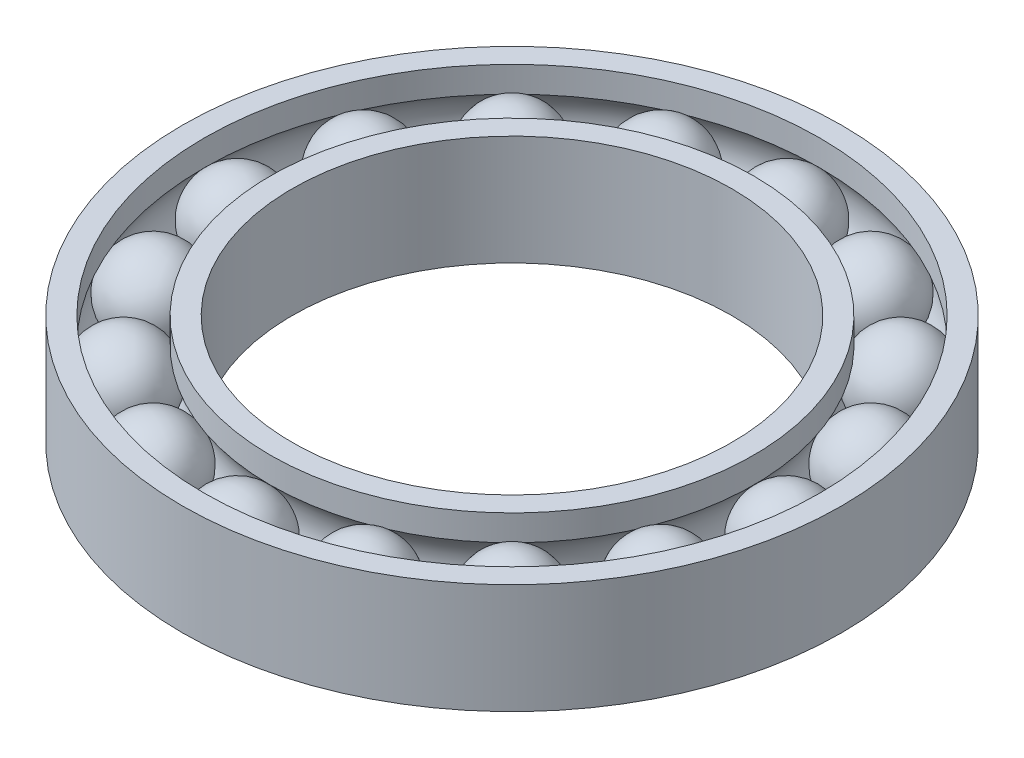
ISO-10303-21;
HEADER;
FILE_DESCRIPTION(('STEP AP214'),'2;1');
FILE_NAME('part.step','',(''),(''),'','','');
FILE_SCHEMA(('AUTOMOTIVE_DESIGN { 1 0 10303 214 1 1 1 1 }'));
ENDSEC;
DATA;
#1=APPLICATION_CONTEXT('core data for automotive mechanical design processes');
#2=APPLICATION_PROTOCOL_DEFINITION('international standard','automotive_design',2000,#1);
#3=PRODUCT_CONTEXT('',#1,'mechanical');
#4=PRODUCT('Part','Part','',(#3));
#5=PRODUCT_RELATED_PRODUCT_CATEGORY('part','',(#4));
#6=PRODUCT_DEFINITION_FORMATION('','',#4);
#7=PRODUCT_DEFINITION_CONTEXT('part definition',#1,'design');
#8=PRODUCT_DEFINITION('design','',#6,#7);
#9=PRODUCT_DEFINITION_SHAPE('','',#8);
#10=(LENGTH_UNIT() NAMED_UNIT(*) SI_UNIT(.MILLI.,.METRE.));
#11=(NAMED_UNIT(*) PLANE_ANGLE_UNIT() SI_UNIT($,.RADIAN.));
#12=(NAMED_UNIT(*) SI_UNIT($,.STERADIAN.) SOLID_ANGLE_UNIT());
#13=UNCERTAINTY_MEASURE_WITH_UNIT(LENGTH_MEASURE(1.E-05),#10,'distance_accuracy_value','');
#14=(GEOMETRIC_REPRESENTATION_CONTEXT(3) GLOBAL_UNCERTAINTY_ASSIGNED_CONTEXT((#13)) GLOBAL_UNIT_ASSIGNED_CONTEXT((#10,
#11,#12)) REPRESENTATION_CONTEXT('',''));
#15=CARTESIAN_POINT('',(0.,0.,0.));
#16=DIRECTION('',(0.,0.,1.));
#17=DIRECTION('',(1.,0.,0.));
#18=AXIS2_PLACEMENT_3D('',#15,#16,#17);
#19=CARTESIAN_POINT('',(23.9177145228173,0.,-57.7424707819557));
#20=DIRECTION('',(-0.382683432365077,0.,0.923879532511292));
#21=DIRECTION('',(0.,-1.,0.));
#22=AXIS2_PLACEMENT_3D('',#19,#20,#21);
#23=SPHERICAL_SURFACE('',#22,9.99999999999999);
#24=CARTESIAN_POINT('',(20.0908801991666,0.,-48.5036754568428));
#25=VERTEX_POINT('',#24);
#26=VERTEX_LOOP('',#25);
#27=FACE_BOUND('',#26,.T.);
#28=ADVANCED_FACE('F44',(#27),#23,.T.);
#29=CLOSED_SHELL('',(#28));
#30=MANIFOLD_SOLID_BREP('B2',#29);
#31=CARTESIAN_POINT('',(44.1941738241587,0.,-44.1941738241598));
#32=DIRECTION('',(-0.707106781186539,0.,0.707106781186556));
#33=DIRECTION('',(0.,-1.,0.));
#34=AXIS2_PLACEMENT_3D('',#31,#32,#33);
#35=SPHERICAL_SURFACE('',#34,9.99999999999999);
#36=CARTESIAN_POINT('',(37.1231060122933,0.,-37.1231060122942));
#37=VERTEX_POINT('',#36);
#38=VERTEX_LOOP('',#37);
#39=FACE_BOUND('',#38,.T.);
#40=ADVANCED_FACE('F63',(#39),#35,.T.);
#41=CLOSED_SHELL('',(#40));
#42=MANIFOLD_SOLID_BREP('B6',#41);
#43=CARTESIAN_POINT('',(57.7424707819552,0.,-23.9177145228187));
#44=DIRECTION('',(-0.923879532511283,0.,0.3826834323651));
#45=DIRECTION('',(0.,-1.,0.));
#46=AXIS2_PLACEMENT_3D('',#43,#44,#45);
#47=SPHERICAL_SURFACE('',#46,9.99999999999999);
#48=CARTESIAN_POINT('',(48.5036754568423,0.,-20.0908801991677));
#49=VERTEX_POINT('',#48);
#50=VERTEX_LOOP('',#49);
#51=FACE_BOUND('',#50,.T.);
#52=ADVANCED_FACE('F82',(#51),#47,.T.);
#53=CLOSED_SHELL('',(#52));
#54=MANIFOLD_SOLID_BREP('B40',#53);
#55=CARTESIAN_POINT('',(62.5,0.,-6.54652751033088E-13));
#56=DIRECTION('',(-1.,0.,0.));
#57=DIRECTION('',(0.,-1.,0.));
#58=AXIS2_PLACEMENT_3D('',#55,#56,#57);
#59=SPHERICAL_SURFACE('',#58,9.99999999999999);
#60=CARTESIAN_POINT('',(52.5,0.,-5.49908310867794E-13));
#61=VERTEX_POINT('',#60);
#62=VERTEX_LOOP('',#61);
#63=FACE_BOUND('',#62,.T.);
#64=ADVANCED_FACE('F101',(#63),#59,.T.);
#65=CLOSED_SHELL('',(#64));
#66=MANIFOLD_SOLID_BREP('B59',#65);
#67=CARTESIAN_POINT('',(57.7424707819557,0.,23.9177145228175));
#68=DIRECTION('',(-0.923879532511291,0.,-0.382683432365081));
#69=DIRECTION('',(0.,-1.,0.));
#70=AXIS2_PLACEMENT_3D('',#67,#68,#69);
#71=SPHERICAL_SURFACE('',#70,9.99999999999999);
#72=CARTESIAN_POINT('',(48.5036754568428,0.,20.0908801991667));
#73=VERTEX_POINT('',#72);
#74=VERTEX_LOOP('',#73);
#75=FACE_BOUND('',#74,.T.);
#76=ADVANCED_FACE('F120',(#75),#71,.T.);
#77=CLOSED_SHELL('',(#76));
#78=MANIFOLD_SOLID_BREP('B78',#77);
#79=CARTESIAN_POINT('',(44.1941738241596,0.,44.1941738241588));
#80=DIRECTION('',(-0.707106781186554,0.,-0.707106781186541));
#81=DIRECTION('',(0.,-1.,0.));
#82=AXIS2_PLACEMENT_3D('',#79,#80,#81);
#83=SPHERICAL_SURFACE('',#82,9.99999999999999);
#84=CARTESIAN_POINT('',(37.1231060122941,0.,37.1231060122934));
#85=VERTEX_POINT('',#84);
#86=VERTEX_LOOP('',#85);
#87=FACE_BOUND('',#86,.T.);
#88=ADVANCED_FACE('F139',(#87),#83,.T.);
#89=CLOSED_SHELL('',(#88));
#90=MANIFOLD_SOLID_BREP('B97',#89);
#91=CARTESIAN_POINT('',(23.9177145228186,0.,57.7424707819552));
#92=DIRECTION('',(-0.382683432365097,0.,-0.923879532511284));
#93=DIRECTION('',(0.,-1.,0.));
#94=AXIS2_PLACEMENT_3D('',#91,#92,#93);
#95=SPHERICAL_SURFACE('',#94,9.99999999999999);
#96=CARTESIAN_POINT('',(20.0908801991676,0.,48.5036754568424));
#97=VERTEX_POINT('',#96);
#98=VERTEX_LOOP('',#97);
#99=FACE_BOUND('',#98,.T.);
#100=ADVANCED_FACE('F158',(#99),#95,.T.);
#101=CLOSED_SHELL('',(#100));
#102=MANIFOLD_SOLID_BREP('B116',#101);
#103=CARTESIAN_POINT('',(0.,0.,62.5));
#104=DIRECTION('',(0.,0.,-1.));
#105=DIRECTION('',(0.,-1.,0.));
#106=AXIS2_PLACEMENT_3D('',#103,#104,#105);
#107=SPHERICAL_SURFACE('',#106,9.99999999999999);
#108=CARTESIAN_POINT('',(0.,0.,52.5));
#109=VERTEX_POINT('',#108);
#110=VERTEX_LOOP('',#109);
#111=FACE_BOUND('',#110,.T.);
#112=ADVANCED_FACE('F177',(#111),#107,.T.);
#113=CLOSED_SHELL('',(#112));
#114=MANIFOLD_SOLID_BREP('B135',#113);
#115=CARTESIAN_POINT('',(-23.9177145228178,0.,57.7424707819556));
#116=DIRECTION('',(0.382683432365084,0.,-0.923879532511289));
#117=DIRECTION('',(0.,-1.,0.));
#118=AXIS2_PLACEMENT_3D('',#115,#116,#117);
#119=SPHERICAL_SURFACE('',#118,9.99999999999999);
#120=CARTESIAN_POINT('',(-20.0908801991669,0.,48.5036754568427));
#121=VERTEX_POINT('',#120);
#122=VERTEX_LOOP('',#121);
#123=FACE_BOUND('',#122,.T.);
#124=ADVANCED_FACE('F196',(#123),#119,.T.);
#125=CLOSED_SHELL('',(#124));
#126=MANIFOLD_SOLID_BREP('B154',#125);
#127=CARTESIAN_POINT('',(-44.194173824159,0.,44.1941738241594));
#128=DIRECTION('',(0.707106781186544,0.,-0.707106781186551));
#129=DIRECTION('',(0.,-1.,0.));
#130=AXIS2_PLACEMENT_3D('',#127,#128,#129);
#131=SPHERICAL_SURFACE('',#130,9.99999999999999);
#132=CARTESIAN_POINT('',(-37.1231060122936,0.,37.1231060122939));
#133=VERTEX_POINT('',#132);
#134=VERTEX_LOOP('',#133);
#135=FACE_BOUND('',#134,.T.);
#136=ADVANCED_FACE('F215',(#135),#131,.T.);
#137=CLOSED_SHELL('',(#136));
#138=MANIFOLD_SOLID_BREP('B173',#137);
#139=CARTESIAN_POINT('',(-57.7424707819553,0.,23.9177145228184));
#140=DIRECTION('',(0.923879532511285,0.,-0.382683432365094));
#141=DIRECTION('',(0.,-1.,0.));
#142=AXIS2_PLACEMENT_3D('',#139,#140,#141);
#143=SPHERICAL_SURFACE('',#142,9.99999999999999);
#144=CARTESIAN_POINT('',(-48.5036754568425,0.,20.0908801991674));
#145=VERTEX_POINT('',#144);
#146=VERTEX_LOOP('',#145);
#147=FACE_BOUND('',#146,.T.);
#148=ADVANCED_FACE('F234',(#147),#143,.T.);
#149=CLOSED_SHELL('',(#148));
#150=MANIFOLD_SOLID_BREP('B192',#149);
#151=CARTESIAN_POINT('',(-62.5,0.,2.18217583677696E-13));
#152=DIRECTION('',(1.,0.,0.));
#153=DIRECTION('',(0.,-1.,0.));
#154=AXIS2_PLACEMENT_3D('',#151,#152,#153);
#155=SPHERICAL_SURFACE('',#154,9.99999999999999);
#156=CARTESIAN_POINT('',(-52.5,0.,1.83302770289265E-13));
#157=VERTEX_POINT('',#156);
#158=VERTEX_LOOP('',#157);
#159=FACE_BOUND('',#158,.T.);
#160=ADVANCED_FACE('F253',(#159),#155,.T.);
#161=CLOSED_SHELL('',(#160));
#162=MANIFOLD_SOLID_BREP('B211',#161);
#163=CARTESIAN_POINT('',(-57.7424707819555,0.,-23.917714522818));
#164=DIRECTION('',(0.923879532511288,0.,0.382683432365087));
#165=DIRECTION('',(0.,-1.,0.));
#166=AXIS2_PLACEMENT_3D('',#163,#164,#165);
#167=SPHERICAL_SURFACE('',#166,9.99999999999999);
#168=CARTESIAN_POINT('',(-48.5036754568426,0.,-20.0908801991671));
#169=VERTEX_POINT('',#168);
#170=VERTEX_LOOP('',#169);
#171=FACE_BOUND('',#170,.T.);
#172=ADVANCED_FACE('F272',(#171),#167,.T.);
#173=CLOSED_SHELL('',(#172));
#174=MANIFOLD_SOLID_BREP('B230',#173);
#175=CARTESIAN_POINT('',(-44.1941738241593,0.,-44.1941738241591));
#176=DIRECTION('',(0.707106781186549,0.,0.707106781186546));
#177=DIRECTION('',(0.,-1.,0.));
#178=AXIS2_PLACEMENT_3D('',#175,#176,#177);
#179=SPHERICAL_SURFACE('',#178,9.99999999999999);
#180=CARTESIAN_POINT('',(-37.1231060122938,0.,-37.1231060122937));
#181=VERTEX_POINT('',#180);
#182=VERTEX_LOOP('',#181);
#183=FACE_BOUND('',#182,.T.);
#184=ADVANCED_FACE('F291',(#183),#179,.T.);
#185=CLOSED_SHELL('',(#184));
#186=MANIFOLD_SOLID_BREP('B249',#185);
#187=CARTESIAN_POINT('',(-23.9177145228182,0.,-57.7424707819554));
#188=DIRECTION('',(0.382683432365091,0.,0.923879532511287));
#189=DIRECTION('',(0.,-1.,0.));
#190=AXIS2_PLACEMENT_3D('',#187,#188,#189);
#191=SPHERICAL_SURFACE('',#190,9.99999999999999);
#192=CARTESIAN_POINT('',(-20.0908801991673,0.,-48.5036754568426));
#193=VERTEX_POINT('',#192);
#194=VERTEX_LOOP('',#193);
#195=FACE_BOUND('',#194,.T.);
#196=ADVANCED_FACE('F312',(#195),#191,.T.);
#197=CLOSED_SHELL('',(#196));
#198=MANIFOLD_SOLID_BREP('B268',#197);
#199=CARTESIAN_POINT('',(0.,0.,0.));
#200=DIRECTION('',(0.,-1.,0.));
#201=DIRECTION('',(0.,0.,-1.));
#202=AXIS2_PLACEMENT_3D('',#199,#200,#201);
#203=TOROIDAL_SURFACE('',#202,62.5,10.);
#204=CARTESIAN_POINT('',(0.,6.61437827766148,0.));
#205=DIRECTION('',(0.,-1.,0.));
#206=DIRECTION('',(0.,0.,-1.));
#207=AXIS2_PLACEMENT_3D('',#204,#205,#206);
#208=CIRCLE('',#207,70.);
#209=CARTESIAN_POINT('',(0.,6.61437827766149,-70.));
#210=VERTEX_POINT('',#209);
#211=EDGE_CURVE('E360',#210,#210,#208,.T.);
#212=ORIENTED_EDGE('',*,*,#211,.F.);
#213=EDGE_LOOP('',(#212));
#214=FACE_BOUND('',#213,.T.);
#215=CARTESIAN_POINT('',(0.,-6.61437827766149,0.));
#216=DIRECTION('',(0.,-1.,0.));
#217=DIRECTION('',(0.,0.,-1.));
#218=AXIS2_PLACEMENT_3D('',#215,#216,#217);
#219=CIRCLE('',#218,70.);
#220=CARTESIAN_POINT('',(0.,-6.61437827766149,-70.));
#221=VERTEX_POINT('',#220);
#222=EDGE_CURVE('E311',#221,#221,#219,.T.);
#223=ORIENTED_EDGE('',*,*,#222,.T.);
#224=EDGE_LOOP('',(#223));
#225=FACE_BOUND('',#224,.T.);
#226=ADVANCED_FACE('F333',(#214,#225),#203,.F.);
#227=CARTESIAN_POINT('',(0.,-12.5,0.));
#228=DIRECTION('',(0.,-1.,0.));
#229=DIRECTION('',(0.,0.,-1.));
#230=AXIS2_PLACEMENT_3D('',#227,#228,#229);
#231=CYLINDRICAL_SURFACE('',#230,70.);
#232=ORIENTED_EDGE('',*,*,#222,.F.);
#233=EDGE_LOOP('',(#232));
#234=FACE_BOUND('',#233,.T.);
#235=CARTESIAN_POINT('',(0.,-12.5,0.));
#236=DIRECTION('',(0.,-1.,0.));
#237=DIRECTION('',(0.,0.,-1.));
#238=AXIS2_PLACEMENT_3D('',#235,#236,#237);
#239=CIRCLE('',#238,70.);
#240=CARTESIAN_POINT('',(0.,-12.5,-70.));
#241=VERTEX_POINT('',#240);
#242=EDGE_CURVE('E340',#241,#241,#239,.T.);
#243=ORIENTED_EDGE('',*,*,#242,.T.);
#244=EDGE_LOOP('',(#243));
#245=FACE_BOUND('',#244,.T.);
#246=ADVANCED_FACE('F368',(#234,#245),#231,.F.);
#247=CARTESIAN_POINT('',(0.,-12.5,0.));
#248=DIRECTION('',(0.,-1.,0.));
#249=DIRECTION('',(0.,0.,-1.));
#250=AXIS2_PLACEMENT_3D('',#247,#248,#249);
#251=PLANE('',#250);
#252=CARTESIAN_POINT('',(0.,-12.5,0.));
#253=DIRECTION('',(0.,-1.,0.));
#254=DIRECTION('',(0.,0.,-1.));
#255=AXIS2_PLACEMENT_3D('',#252,#253,#254);
#256=CIRCLE('',#255,75.);
#257=CARTESIAN_POINT('',(0.,-12.5,-75.));
#258=VERTEX_POINT('',#257);
#259=EDGE_CURVE('E345',#258,#258,#256,.T.);
#260=ORIENTED_EDGE('',*,*,#259,.T.);
#261=EDGE_LOOP('',(#260));
#262=FACE_BOUND('',#261,.T.);
#263=ORIENTED_EDGE('',*,*,#242,.F.);
#264=EDGE_LOOP('',(#263));
#265=FACE_BOUND('',#264,.T.);
#266=ADVANCED_FACE('F372',(#262,#265),#251,.T.);
#267=CARTESIAN_POINT('',(0.,-12.5,0.));
#268=DIRECTION('',(0.,-1.,0.));
#269=DIRECTION('',(0.,0.,-1.));
#270=AXIS2_PLACEMENT_3D('',#267,#268,#269);
#271=CYLINDRICAL_SURFACE('',#270,75.);
#272=CARTESIAN_POINT('',(0.,12.5,0.));
#273=DIRECTION('',(0.,-1.,0.));
#274=DIRECTION('',(0.,0.,-1.));
#275=AXIS2_PLACEMENT_3D('',#272,#273,#274);
#276=CIRCLE('',#275,75.);
#277=CARTESIAN_POINT('',(0.,12.5,-75.));
#278=VERTEX_POINT('',#277);
#279=EDGE_CURVE('E350',#278,#278,#276,.T.);
#280=ORIENTED_EDGE('',*,*,#279,.T.);
#281=EDGE_LOOP('',(#280));
#282=FACE_BOUND('',#281,.T.);
#283=ORIENTED_EDGE('',*,*,#259,.F.);
#284=EDGE_LOOP('',(#283));
#285=FACE_BOUND('',#284,.T.);
#286=ADVANCED_FACE('F377',(#282,#285),#271,.T.);
#287=CARTESIAN_POINT('',(0.,12.5,0.));
#288=DIRECTION('',(0.,-1.,0.));
#289=DIRECTION('',(0.,0.,-1.));
#290=AXIS2_PLACEMENT_3D('',#287,#288,#289);
#291=PLANE('',#290);
#292=ORIENTED_EDGE('',*,*,#279,.F.);
#293=EDGE_LOOP('',(#292));
#294=FACE_BOUND('',#293,.T.);
#295=CARTESIAN_POINT('',(0.,12.5,0.));
#296=DIRECTION('',(0.,-1.,0.));
#297=DIRECTION('',(0.,0.,-1.));
#298=AXIS2_PLACEMENT_3D('',#295,#296,#297);
#299=CIRCLE('',#298,70.);
#300=CARTESIAN_POINT('',(0.,12.5,-70.));
#301=VERTEX_POINT('',#300);
#302=EDGE_CURVE('E356',#301,#301,#299,.T.);
#303=ORIENTED_EDGE('',*,*,#302,.T.);
#304=EDGE_LOOP('',(#303));
#305=FACE_BOUND('',#304,.T.);
#306=ADVANCED_FACE('F383',(#294,#305),#291,.F.);
#307=CARTESIAN_POINT('',(0.,-12.5,0.));
#308=DIRECTION('',(0.,-1.,0.));
#309=DIRECTION('',(0.,0.,-1.));
#310=AXIS2_PLACEMENT_3D('',#307,#308,#309);
#311=CYLINDRICAL_SURFACE('',#310,70.);
#312=ORIENTED_EDGE('',*,*,#302,.F.);
#313=EDGE_LOOP('',(#312));
#314=FACE_BOUND('',#313,.T.);
#315=ORIENTED_EDGE('',*,*,#211,.T.);
#316=EDGE_LOOP('',(#315));
#317=FACE_BOUND('',#316,.T.);
#318=ADVANCED_FACE('F365',(#314,#317),#311,.F.);
#319=CLOSED_SHELL('',(#226,#246,#266,#286,#306,#318));
#320=MANIFOLD_SOLID_BREP('B287',#319);
#321=CARTESIAN_POINT('',(0.,0.,0.));
#322=DIRECTION('',(0.,-1.,0.));
#323=DIRECTION('',(0.,0.,-1.));
#324=AXIS2_PLACEMENT_3D('',#321,#322,#323);
#325=TOROIDAL_SURFACE('',#324,62.5,9.99999999999999);
#326=CARTESIAN_POINT('',(0.,-6.61437827766146,0.));
#327=DIRECTION('',(0.,-1.,0.));
#328=DIRECTION('',(0.,0.,-1.));
#329=AXIS2_PLACEMENT_3D('',#326,#327,#328);
#330=CIRCLE('',#329,55.);
#331=CARTESIAN_POINT('',(0.,-6.61437827766145,-55.));
#332=VERTEX_POINT('',#331);
#333=EDGE_CURVE('E458',#332,#332,#330,.T.);
#334=ORIENTED_EDGE('',*,*,#333,.F.);
#335=EDGE_LOOP('',(#334));
#336=FACE_BOUND('',#335,.T.);
#337=CARTESIAN_POINT('',(0.,6.61437827766145,0.));
#338=DIRECTION('',(0.,-1.,0.));
#339=DIRECTION('',(0.,0.,-1.));
#340=AXIS2_PLACEMENT_3D('',#337,#338,#339);
#341=CIRCLE('',#340,55.);
#342=CARTESIAN_POINT('',(0.,6.61437827766145,-55.));
#343=VERTEX_POINT('',#342);
#344=EDGE_CURVE('E332',#343,#343,#341,.T.);
#345=ORIENTED_EDGE('',*,*,#344,.T.);
#346=EDGE_LOOP('',(#345));
#347=FACE_BOUND('',#346,.T.);
#348=ADVANCED_FACE('F436',(#336,#347),#325,.F.);
#349=CARTESIAN_POINT('',(0.,-12.5,0.));
#350=DIRECTION('',(0.,-1.,0.));
#351=DIRECTION('',(0.,0.,-1.));
#352=AXIS2_PLACEMENT_3D('',#349,#350,#351);
#353=CYLINDRICAL_SURFACE('',#352,55.);
#354=CARTESIAN_POINT('',(0.,12.5,0.));
#355=DIRECTION('',(0.,-1.,0.));
#356=DIRECTION('',(0.,0.,-1.));
#357=AXIS2_PLACEMENT_3D('',#354,#355,#356);
#358=CIRCLE('',#357,55.);
#359=CARTESIAN_POINT('',(0.,12.5,-55.));
#360=VERTEX_POINT('',#359);
#361=EDGE_CURVE('E442',#360,#360,#358,.T.);
#362=ORIENTED_EDGE('',*,*,#361,.T.);
#363=EDGE_LOOP('',(#362));
#364=FACE_BOUND('',#363,.T.);
#365=ORIENTED_EDGE('',*,*,#344,.F.);
#366=EDGE_LOOP('',(#365));
#367=FACE_BOUND('',#366,.T.);
#368=ADVANCED_FACE('F466',(#364,#367),#353,.T.);
#369=CARTESIAN_POINT('',(0.,12.5,0.));
#370=DIRECTION('',(0.,-1.,0.));
#371=DIRECTION('',(0.,0.,-1.));
#372=AXIS2_PLACEMENT_3D('',#369,#370,#371);
#373=PLANE('',#372);
#374=ORIENTED_EDGE('',*,*,#361,.F.);
#375=EDGE_LOOP('',(#374));
#376=FACE_BOUND('',#375,.T.);
#377=CARTESIAN_POINT('',(0.,12.5,0.));
#378=DIRECTION('',(0.,-1.,0.));
#379=DIRECTION('',(0.,0.,-1.));
#380=AXIS2_PLACEMENT_3D('',#377,#378,#379);
#381=CIRCLE('',#380,50.);
#382=CARTESIAN_POINT('',(0.,12.5,-50.));
#383=VERTEX_POINT('',#382);
#384=EDGE_CURVE('E446',#383,#383,#381,.T.);
#385=ORIENTED_EDGE('',*,*,#384,.T.);
#386=EDGE_LOOP('',(#385));
#387=FACE_BOUND('',#386,.T.);
#388=ADVANCED_FACE('F470',(#376,#387),#373,.F.);
#389=CARTESIAN_POINT('',(0.,-12.5,0.));
#390=DIRECTION('',(0.,-1.,0.));
#391=DIRECTION('',(0.,0.,-1.));
#392=AXIS2_PLACEMENT_3D('',#389,#390,#391);
#393=CYLINDRICAL_SURFACE('',#392,50.);
#394=ORIENTED_EDGE('',*,*,#384,.F.);
#395=EDGE_LOOP('',(#394));
#396=FACE_BOUND('',#395,.T.);
#397=CARTESIAN_POINT('',(0.,-12.5,0.));
#398=DIRECTION('',(0.,-1.,0.));
#399=DIRECTION('',(0.,0.,-1.));
#400=AXIS2_PLACEMENT_3D('',#397,#398,#399);
#401=CIRCLE('',#400,50.);
#402=CARTESIAN_POINT('',(0.,-12.5,-50.));
#403=VERTEX_POINT('',#402);
#404=EDGE_CURVE('E450',#403,#403,#401,.T.);
#405=ORIENTED_EDGE('',*,*,#404,.T.);
#406=EDGE_LOOP('',(#405));
#407=FACE_BOUND('',#406,.T.);
#408=ADVANCED_FACE('F474',(#396,#407),#393,.F.);
#409=CARTESIAN_POINT('',(0.,-12.5,0.));
#410=DIRECTION('',(0.,-1.,0.));
#411=DIRECTION('',(0.,0.,-1.));
#412=AXIS2_PLACEMENT_3D('',#409,#410,#411);
#413=PLANE('',#412);
#414=CARTESIAN_POINT('',(0.,-12.5,0.));
#415=DIRECTION('',(0.,-1.,0.));
#416=DIRECTION('',(0.,0.,-1.));
#417=AXIS2_PLACEMENT_3D('',#414,#415,#416);
#418=CIRCLE('',#417,55.);
#419=CARTESIAN_POINT('',(0.,-12.5,-55.));
#420=VERTEX_POINT('',#419);
#421=EDGE_CURVE('E455',#420,#420,#418,.T.);
#422=ORIENTED_EDGE('',*,*,#421,.T.);
#423=EDGE_LOOP('',(#422));
#424=FACE_BOUND('',#423,.T.);
#425=ORIENTED_EDGE('',*,*,#404,.F.);
#426=EDGE_LOOP('',(#425));
#427=FACE_BOUND('',#426,.T.);
#428=ADVANCED_FACE('F481',(#424,#427),#413,.T.);
#429=CARTESIAN_POINT('',(0.,-12.5,0.));
#430=DIRECTION('',(0.,-1.,0.));
#431=DIRECTION('',(0.,0.,-1.));
#432=AXIS2_PLACEMENT_3D('',#429,#430,#431);
#433=CYLINDRICAL_SURFACE('',#432,55.);
#434=ORIENTED_EDGE('',*,*,#333,.T.);
#435=EDGE_LOOP('',(#434));
#436=FACE_BOUND('',#435,.T.);
#437=ORIENTED_EDGE('',*,*,#421,.F.);
#438=EDGE_LOOP('',(#437));
#439=FACE_BOUND('',#438,.T.);
#440=ADVANCED_FACE('F462',(#436,#439),#433,.T.);
#441=CLOSED_SHELL('',(#348,#368,#388,#408,#428,#440));
#442=MANIFOLD_SOLID_BREP('B306',#441);
#443=CARTESIAN_POINT('',(0.,0.,-62.5));
#444=DIRECTION('',(0.,0.,1.));
#445=DIRECTION('',(0.,-1.,0.));
#446=AXIS2_PLACEMENT_3D('',#443,#444,#445);
#447=SPHERICAL_SURFACE('',#446,9.99999999999999);
#448=CARTESIAN_POINT('',(0.,0.,-52.5));
#449=VERTEX_POINT('',#448);
#450=VERTEX_LOOP('',#449);
#451=FACE_BOUND('',#450,.T.);
#452=ADVANCED_FACE('F528',(#451),#447,.T.);
#453=CLOSED_SHELL('',(#452));
#454=MANIFOLD_SOLID_BREP('B327',#453);
#455=ADVANCED_BREP_SHAPE_REPRESENTATION('',(#18,#30,#42,#54,#66,#78,#90,#102,#114,#126,#138,
#150,#162,#174,#186,#198,#320,#442,#454),#14);
#456=SHAPE_DEFINITION_REPRESENTATION(#9,#455);
ENDSEC;
END-ISO-10303-21;
